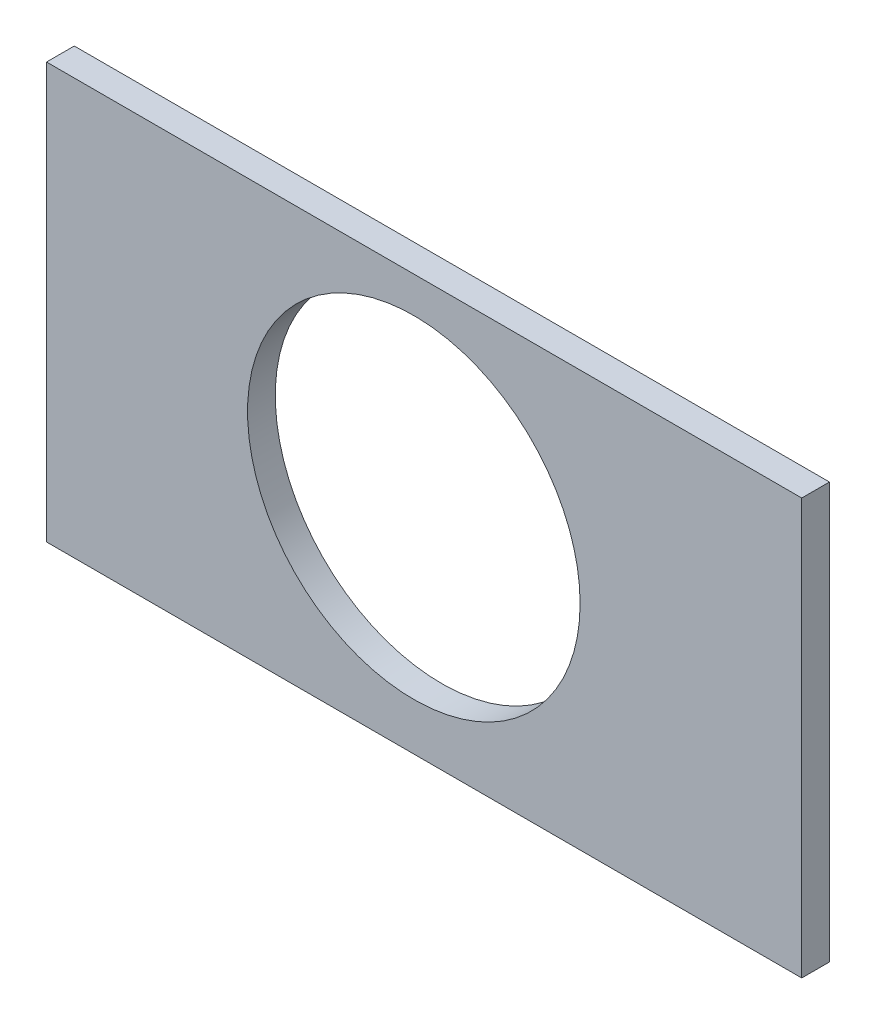
ISO-10303-21;
HEADER;
FILE_DESCRIPTION(('STEP AP214'),'2;1');
FILE_NAME('part.step','',(''),(''),'','','');
FILE_SCHEMA(('AUTOMOTIVE_DESIGN { 1 0 10303 214 1 1 1 1 }'));
ENDSEC;
DATA;
#1=APPLICATION_CONTEXT('core data for automotive mechanical design processes');
#2=APPLICATION_PROTOCOL_DEFINITION('international standard','automotive_design',2000,#1);
#3=PRODUCT_CONTEXT('',#1,'mechanical');
#4=PRODUCT('Part','Part','',(#3));
#5=PRODUCT_RELATED_PRODUCT_CATEGORY('part','',(#4));
#6=PRODUCT_DEFINITION_FORMATION('','',#4);
#7=PRODUCT_DEFINITION_CONTEXT('part definition',#1,'design');
#8=PRODUCT_DEFINITION('design','',#6,#7);
#9=PRODUCT_DEFINITION_SHAPE('','',#8);
#10=(LENGTH_UNIT() NAMED_UNIT(*) SI_UNIT(.MILLI.,.METRE.));
#11=(NAMED_UNIT(*) PLANE_ANGLE_UNIT() SI_UNIT($,.RADIAN.));
#12=(NAMED_UNIT(*) SI_UNIT($,.STERADIAN.) SOLID_ANGLE_UNIT());
#13=UNCERTAINTY_MEASURE_WITH_UNIT(LENGTH_MEASURE(1.E-05),#10,'distance_accuracy_value','');
#14=(GEOMETRIC_REPRESENTATION_CONTEXT(3) GLOBAL_UNCERTAINTY_ASSIGNED_CONTEXT((#13)) GLOBAL_UNIT_ASSIGNED_CONTEXT((#10,
#11,#12)) REPRESENTATION_CONTEXT('',''));
#15=CARTESIAN_POINT('',(0.,0.,0.));
#16=DIRECTION('',(0.,0.,1.));
#17=DIRECTION('',(1.,0.,0.));
#18=AXIS2_PLACEMENT_3D('',#15,#16,#17);
#19=CARTESIAN_POINT('',(0.,0.,2.));
#20=DIRECTION('',(0.,0.,-1.));
#21=DIRECTION('',(-1.,0.,0.));
#22=AXIS2_PLACEMENT_3D('',#19,#20,#21);
#23=PLANE('',#22);
#24=DIRECTION('',(0.,1.,0.));
#25=VECTOR('',#24,1.);
#26=CARTESIAN_POINT('',(27.25,-15.,2.));
#27=LINE('',#26,#25);
#28=CARTESIAN_POINT('',(27.25,-15.,2.));
#29=VERTEX_POINT('',#28);
#30=CARTESIAN_POINT('',(27.25,15.,2.));
#31=VERTEX_POINT('',#30);
#32=EDGE_CURVE('E86',#29,#31,#27,.T.);
#33=ORIENTED_EDGE('',*,*,#32,.T.);
#34=DIRECTION('',(-1.,0.,0.));
#35=VECTOR('',#34,1.);
#36=CARTESIAN_POINT('',(-27.25,15.,2.));
#37=LINE('',#36,#35);
#38=CARTESIAN_POINT('',(-27.25,15.,2.));
#39=VERTEX_POINT('',#38);
#40=EDGE_CURVE('E81',#31,#39,#37,.T.);
#41=ORIENTED_EDGE('',*,*,#40,.T.);
#42=DIRECTION('',(0.,-1.,0.));
#43=VECTOR('',#42,1.);
#44=CARTESIAN_POINT('',(-27.25,-15.,2.));
#45=LINE('',#44,#43);
#46=CARTESIAN_POINT('',(-27.25,-15.,2.));
#47=VERTEX_POINT('',#46);
#48=EDGE_CURVE('E84',#39,#47,#45,.T.);
#49=ORIENTED_EDGE('',*,*,#48,.T.);
#50=DIRECTION('',(1.,0.,0.));
#51=VECTOR('',#50,1.);
#52=CARTESIAN_POINT('',(-27.25,-15.,2.));
#53=LINE('',#52,#51);
#54=EDGE_CURVE('E51',#47,#29,#53,.T.);
#55=ORIENTED_EDGE('',*,*,#54,.T.);
#56=EDGE_LOOP('',(#33,#41,#49,#55));
#57=FACE_BOUND('',#56,.T.);
#58=CARTESIAN_POINT('',(-0.743755418231375,0.409406652237456,2.));
#59=DIRECTION('',(0.,0.,1.));
#60=DIRECTION('',(1.,0.,0.));
#61=AXIS2_PLACEMENT_3D('',#58,#59,#60);
#62=CIRCLE('',#61,12.);
#63=CARTESIAN_POINT('',(11.2562445817686,0.409406652237456,2.));
#64=VERTEX_POINT('',#63);
#65=EDGE_CURVE('E101',#64,#64,#62,.T.);
#66=ORIENTED_EDGE('',*,*,#65,.F.);
#67=EDGE_LOOP('',(#66));
#68=FACE_BOUND('',#67,.T.);
#69=ADVANCED_FACE('F34',(#57,#68),#23,.F.);
#70=CARTESIAN_POINT('',(0.,0.,0.));
#71=DIRECTION('',(0.,0.,-1.));
#72=DIRECTION('',(-1.,0.,0.));
#73=AXIS2_PLACEMENT_3D('',#70,#71,#72);
#74=PLANE('',#73);
#75=DIRECTION('',(0.,1.,0.));
#76=VECTOR('',#75,1.);
#77=CARTESIAN_POINT('',(27.25,-15.,0.));
#78=LINE('',#77,#76);
#79=CARTESIAN_POINT('',(27.25,-15.,0.));
#80=VERTEX_POINT('',#79);
#81=CARTESIAN_POINT('',(27.25,15.,0.));
#82=VERTEX_POINT('',#81);
#83=EDGE_CURVE('E98',#80,#82,#78,.T.);
#84=ORIENTED_EDGE('',*,*,#83,.F.);
#85=DIRECTION('',(1.,0.,0.));
#86=VECTOR('',#85,1.);
#87=CARTESIAN_POINT('',(-27.25,-15.,0.));
#88=LINE('',#87,#86);
#89=CARTESIAN_POINT('',(-27.25,-15.,0.));
#90=VERTEX_POINT('',#89);
#91=EDGE_CURVE('E74',#90,#80,#88,.T.);
#92=ORIENTED_EDGE('',*,*,#91,.F.);
#93=DIRECTION('',(0.,-1.,0.));
#94=VECTOR('',#93,1.);
#95=CARTESIAN_POINT('',(-27.25,-15.,0.));
#96=LINE('',#95,#94);
#97=CARTESIAN_POINT('',(-27.25,15.,0.));
#98=VERTEX_POINT('',#97);
#99=EDGE_CURVE('E68',#98,#90,#96,.T.);
#100=ORIENTED_EDGE('',*,*,#99,.F.);
#101=DIRECTION('',(-1.,0.,0.));
#102=VECTOR('',#101,1.);
#103=CARTESIAN_POINT('',(-27.25,15.,0.));
#104=LINE('',#103,#102);
#105=EDGE_CURVE('E90',#82,#98,#104,.T.);
#106=ORIENTED_EDGE('',*,*,#105,.F.);
#107=EDGE_LOOP('',(#84,#92,#100,#106));
#108=FACE_BOUND('',#107,.T.);
#109=CARTESIAN_POINT('',(-0.743755418231375,0.409406652237456,0.));
#110=DIRECTION('',(0.,0.,1.));
#111=DIRECTION('',(1.,0.,0.));
#112=AXIS2_PLACEMENT_3D('',#109,#110,#111);
#113=CIRCLE('',#112,12.);
#114=CARTESIAN_POINT('',(11.2562445817686,0.409406652237456,0.));
#115=VERTEX_POINT('',#114);
#116=EDGE_CURVE('E113',#115,#115,#113,.T.);
#117=ORIENTED_EDGE('',*,*,#116,.T.);
#118=EDGE_LOOP('',(#117));
#119=FACE_BOUND('',#118,.T.);
#120=ADVANCED_FACE('F109',(#108,#119),#74,.T.);
#121=CARTESIAN_POINT('',(27.25,-15.,2.));
#122=DIRECTION('',(-1.,0.,0.));
#123=DIRECTION('',(0.,0.,1.));
#124=AXIS2_PLACEMENT_3D('',#121,#122,#123);
#125=PLANE('',#124);
#126=ORIENTED_EDGE('',*,*,#83,.T.);
#127=DIRECTION('',(0.,0.,-1.));
#128=VECTOR('',#127,1.);
#129=CARTESIAN_POINT('',(27.25,15.,2.));
#130=LINE('',#129,#128);
#131=EDGE_CURVE('E11',#31,#82,#130,.T.);
#132=ORIENTED_EDGE('',*,*,#131,.F.);
#133=ORIENTED_EDGE('',*,*,#32,.F.);
#134=DIRECTION('',(0.,0.,-1.));
#135=VECTOR('',#134,1.);
#136=CARTESIAN_POINT('',(27.25,-15.,2.));
#137=LINE('',#136,#135);
#138=EDGE_CURVE('E94',#29,#80,#137,.T.);
#139=ORIENTED_EDGE('',*,*,#138,.T.);
#140=EDGE_LOOP('',(#126,#132,#133,#139));
#141=FACE_BOUND('',#140,.T.);
#142=ADVANCED_FACE('F36',(#141),#125,.F.);
#143=CARTESIAN_POINT('',(-27.25,15.,2.));
#144=DIRECTION('',(0.,-1.,0.));
#145=DIRECTION('',(0.,0.,-1.));
#146=AXIS2_PLACEMENT_3D('',#143,#144,#145);
#147=PLANE('',#146);
#148=ORIENTED_EDGE('',*,*,#105,.T.);
#149=DIRECTION('',(0.,0.,-1.));
#150=VECTOR('',#149,1.);
#151=CARTESIAN_POINT('',(-27.25,15.,2.));
#152=LINE('',#151,#150);
#153=EDGE_CURVE('E43',#39,#98,#152,.T.);
#154=ORIENTED_EDGE('',*,*,#153,.F.);
#155=ORIENTED_EDGE('',*,*,#40,.F.);
#156=ORIENTED_EDGE('',*,*,#131,.T.);
#157=EDGE_LOOP('',(#148,#154,#155,#156));
#158=FACE_BOUND('',#157,.T.);
#159=ADVANCED_FACE('F89',(#158),#147,.F.);
#160=CARTESIAN_POINT('',(-27.25,-15.,2.));
#161=DIRECTION('',(1.,0.,0.));
#162=DIRECTION('',(0.,0.,-1.));
#163=AXIS2_PLACEMENT_3D('',#160,#161,#162);
#164=PLANE('',#163);
#165=ORIENTED_EDGE('',*,*,#99,.T.);
#166=DIRECTION('',(0.,0.,-1.));
#167=VECTOR('',#166,1.);
#168=CARTESIAN_POINT('',(-27.25,-15.,2.));
#169=LINE('',#168,#167);
#170=EDGE_CURVE('E91',#47,#90,#169,.T.);
#171=ORIENTED_EDGE('',*,*,#170,.F.);
#172=ORIENTED_EDGE('',*,*,#48,.F.);
#173=ORIENTED_EDGE('',*,*,#153,.T.);
#174=EDGE_LOOP('',(#165,#171,#172,#173));
#175=FACE_BOUND('',#174,.T.);
#176=ADVANCED_FACE('F92',(#175),#164,.F.);
#177=CARTESIAN_POINT('',(-27.25,-15.,2.));
#178=DIRECTION('',(0.,1.,0.));
#179=DIRECTION('',(0.,0.,1.));
#180=AXIS2_PLACEMENT_3D('',#177,#178,#179);
#181=PLANE('',#180);
#182=ORIENTED_EDGE('',*,*,#91,.T.);
#183=ORIENTED_EDGE('',*,*,#138,.F.);
#184=ORIENTED_EDGE('',*,*,#54,.F.);
#185=ORIENTED_EDGE('',*,*,#170,.T.);
#186=EDGE_LOOP('',(#182,#183,#184,#185));
#187=FACE_BOUND('',#186,.T.);
#188=ADVANCED_FACE('F106',(#187),#181,.F.);
#189=CARTESIAN_POINT('',(-0.743755418231375,0.409406652237456,2.));
#190=DIRECTION('',(0.,0.,-1.));
#191=DIRECTION('',(-1.,0.,0.));
#192=AXIS2_PLACEMENT_3D('',#189,#190,#191);
#193=CYLINDRICAL_SURFACE('',#192,12.);
#194=ORIENTED_EDGE('',*,*,#65,.T.);
#195=EDGE_LOOP('',(#194));
#196=FACE_BOUND('',#195,.T.);
#197=ORIENTED_EDGE('',*,*,#116,.F.);
#198=EDGE_LOOP('',(#197));
#199=FACE_BOUND('',#198,.T.);
#200=ADVANCED_FACE('F119',(#196,#199),#193,.F.);
#201=CLOSED_SHELL('',(#69,#120,#142,#159,#176,#188,#200));
#202=MANIFOLD_SOLID_BREP('B2',#201);
#203=ADVANCED_BREP_SHAPE_REPRESENTATION('',(#18,#202),#14);
#204=SHAPE_DEFINITION_REPRESENTATION(#9,#203);
ENDSEC;
END-ISO-10303-21;
